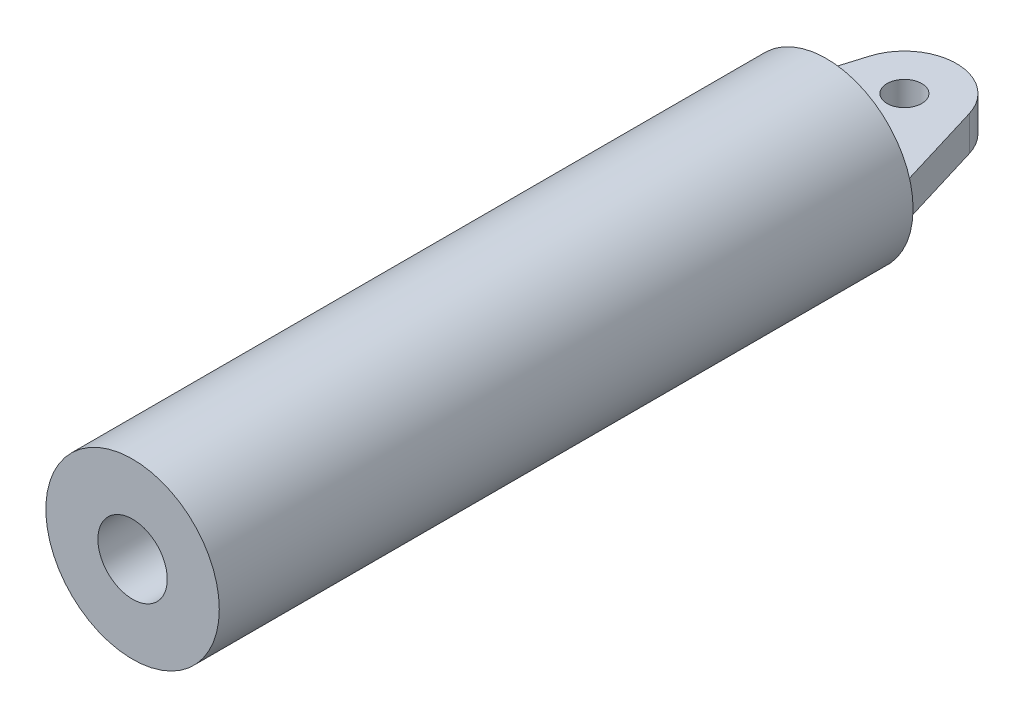
ISO-10303-21;
HEADER;
FILE_DESCRIPTION(('STEP AP214'),'2;1');
FILE_NAME('part.step','',(''),(''),'','','');
FILE_SCHEMA(('AUTOMOTIVE_DESIGN { 1 0 10303 214 1 1 1 1 }'));
ENDSEC;
DATA;
#1=APPLICATION_CONTEXT('core data for automotive mechanical design processes');
#2=APPLICATION_PROTOCOL_DEFINITION('international standard','automotive_design',2000,#1);
#3=PRODUCT_CONTEXT('',#1,'mechanical');
#4=PRODUCT('Part','Part','',(#3));
#5=PRODUCT_RELATED_PRODUCT_CATEGORY('part','',(#4));
#6=PRODUCT_DEFINITION_FORMATION('','',#4);
#7=PRODUCT_DEFINITION_CONTEXT('part definition',#1,'design');
#8=PRODUCT_DEFINITION('design','',#6,#7);
#9=PRODUCT_DEFINITION_SHAPE('','',#8);
#10=(LENGTH_UNIT() NAMED_UNIT(*) SI_UNIT(.MILLI.,.METRE.));
#11=(NAMED_UNIT(*) PLANE_ANGLE_UNIT() SI_UNIT($,.RADIAN.));
#12=(NAMED_UNIT(*) SI_UNIT($,.STERADIAN.) SOLID_ANGLE_UNIT());
#13=UNCERTAINTY_MEASURE_WITH_UNIT(LENGTH_MEASURE(1.E-05),#10,'distance_accuracy_value','');
#14=(GEOMETRIC_REPRESENTATION_CONTEXT(3) GLOBAL_UNCERTAINTY_ASSIGNED_CONTEXT((#13)) GLOBAL_UNIT_ASSIGNED_CONTEXT((#10,
#11,#12)) REPRESENTATION_CONTEXT('',''));
#15=CARTESIAN_POINT('',(0.,0.,0.));
#16=DIRECTION('',(0.,0.,1.));
#17=DIRECTION('',(1.,0.,0.));
#18=AXIS2_PLACEMENT_3D('',#15,#16,#17);
#19=CARTESIAN_POINT('',(0.,0.,0.));
#20=DIRECTION('',(0.,0.,1.));
#21=DIRECTION('',(1.,0.,0.));
#22=AXIS2_PLACEMENT_3D('',#19,#20,#21);
#23=PLANE('',#22);
#24=CARTESIAN_POINT('',(0.,0.,0.));
#25=DIRECTION('',(0.,0.,1.));
#26=DIRECTION('',(1.,0.,0.));
#27=AXIS2_PLACEMENT_3D('',#24,#25,#26);
#28=CIRCLE('',#27,50.);
#29=CARTESIAN_POINT('',(50.,0.,0.));
#30=VERTEX_POINT('',#29);
#31=EDGE_CURVE('E38',#30,#30,#28,.T.);
#32=ORIENTED_EDGE('',*,*,#31,.F.);
#33=EDGE_LOOP('',(#32));
#34=FACE_BOUND('',#33,.T.);
#35=DIRECTION('',(0.,-1.,0.));
#36=VECTOR('',#35,1.);
#37=CARTESIAN_POINT('',(45.,10.,0.));
#38=LINE('',#37,#36);
#39=CARTESIAN_POINT('',(45.,10.,0.));
#40=VERTEX_POINT('',#39);
#41=CARTESIAN_POINT('',(45.,-10.,0.));
#42=VERTEX_POINT('',#41);
#43=EDGE_CURVE('E49',#40,#42,#38,.T.);
#44=ORIENTED_EDGE('',*,*,#43,.F.);
#45=DIRECTION('',(1.,0.,0.));
#46=VECTOR('',#45,1.);
#47=CARTESIAN_POINT('',(-45.,10.,0.));
#48=LINE('',#47,#46);
#49=CARTESIAN_POINT('',(-45.,10.,0.));
#50=VERTEX_POINT('',#49);
#51=EDGE_CURVE('E81',#50,#40,#48,.T.);
#52=ORIENTED_EDGE('',*,*,#51,.F.);
#53=DIRECTION('',(0.,-1.,0.));
#54=VECTOR('',#53,1.);
#55=CARTESIAN_POINT('',(-45.,10.,0.));
#56=LINE('',#55,#54);
#57=CARTESIAN_POINT('',(-45.,-10.,0.));
#58=VERTEX_POINT('',#57);
#59=EDGE_CURVE('E97',#50,#58,#56,.T.);
#60=ORIENTED_EDGE('',*,*,#59,.T.);
#61=DIRECTION('',(1.,0.,0.));
#62=VECTOR('',#61,1.);
#63=CARTESIAN_POINT('',(-45.,-10.,0.));
#64=LINE('',#63,#62);
#65=EDGE_CURVE('E54',#58,#42,#64,.T.);
#66=ORIENTED_EDGE('',*,*,#65,.T.);
#67=EDGE_LOOP('',(#44,#52,#60,#66));
#68=FACE_BOUND('',#67,.T.);
#69=ADVANCED_FACE('F34',(#34,#68),#23,.F.);
#70=CARTESIAN_POINT('',(0.,0.,400.));
#71=DIRECTION('',(0.,0.,-1.));
#72=DIRECTION('',(-1.,0.,0.));
#73=AXIS2_PLACEMENT_3D('',#70,#71,#72);
#74=CYLINDRICAL_SURFACE('',#73,50.);
#75=CARTESIAN_POINT('',(0.,0.,400.));
#76=DIRECTION('',(0.,0.,1.));
#77=DIRECTION('',(1.,0.,0.));
#78=AXIS2_PLACEMENT_3D('',#75,#76,#77);
#79=CIRCLE('',#78,50.);
#80=CARTESIAN_POINT('',(50.,0.,400.));
#81=VERTEX_POINT('',#80);
#82=EDGE_CURVE('E11',#81,#81,#79,.T.);
#83=ORIENTED_EDGE('',*,*,#82,.F.);
#84=EDGE_LOOP('',(#83));
#85=FACE_BOUND('',#84,.T.);
#86=ORIENTED_EDGE('',*,*,#31,.T.);
#87=EDGE_LOOP('',(#86));
#88=FACE_BOUND('',#87,.T.);
#89=ADVANCED_FACE('F36',(#85,#88),#74,.T.);
#90=CARTESIAN_POINT('',(0.,0.,400.));
#91=DIRECTION('',(0.,0.,1.));
#92=DIRECTION('',(1.,0.,0.));
#93=AXIS2_PLACEMENT_3D('',#90,#91,#92);
#94=PLANE('',#93);
#95=CARTESIAN_POINT('',(0.,0.,400.));
#96=DIRECTION('',(0.,0.,1.));
#97=DIRECTION('',(1.,0.,0.));
#98=AXIS2_PLACEMENT_3D('',#95,#96,#97);
#99=CIRCLE('',#98,20.);
#100=CARTESIAN_POINT('',(20.,0.,400.));
#101=VERTEX_POINT('',#100);
#102=EDGE_CURVE('E156',#101,#101,#99,.T.);
#103=ORIENTED_EDGE('',*,*,#102,.F.);
#104=EDGE_LOOP('',(#103));
#105=FACE_BOUND('',#104,.T.);
#106=ORIENTED_EDGE('',*,*,#82,.T.);
#107=EDGE_LOOP('',(#106));
#108=FACE_BOUND('',#107,.T.);
#109=ADVANCED_FACE('F119',(#105,#108),#94,.T.);
#110=CARTESIAN_POINT('',(0.,10.,-45.));
#111=DIRECTION('',(0.,-1.,0.));
#112=DIRECTION('',(0.,0.,-1.));
#113=AXIS2_PLACEMENT_3D('',#110,#111,#112);
#114=PLANE('',#113);
#115=ORIENTED_EDGE('',*,*,#51,.T.);
#116=DIRECTION('',(-0.29027623112899,0.,-0.956942897795657));
#117=VECTOR('',#116,1.);
#118=CARTESIAN_POINT('',(28.7082869338697,10.,-53.7082869338697));
#119=LINE('',#118,#117);
#120=CARTESIAN_POINT('',(28.7082869338697,10.,-53.7082869338697));
#121=VERTEX_POINT('',#120);
#122=EDGE_CURVE('E73',#40,#121,#119,.T.);
#123=ORIENTED_EDGE('',*,*,#122,.T.);
#124=CARTESIAN_POINT('',(0.,10.,-45.));
#125=DIRECTION('',(0.,1.,0.));
#126=DIRECTION('',(0.,0.,-1.));
#127=AXIS2_PLACEMENT_3D('',#124,#125,#126);
#128=CIRCLE('',#127,30.);
#129=CARTESIAN_POINT('',(-28.7082869338697,10.,-53.7082869338697));
#130=VERTEX_POINT('',#129);
#131=EDGE_CURVE('E79',#121,#130,#128,.T.);
#132=ORIENTED_EDGE('',*,*,#131,.T.);
#133=DIRECTION('',(-0.29027623112899,0.,0.956942897795657));
#134=VECTOR('',#133,1.);
#135=CARTESIAN_POINT('',(-45.,10.,0.));
#136=LINE('',#135,#134);
#137=EDGE_CURVE('E95',#130,#50,#136,.T.);
#138=ORIENTED_EDGE('',*,*,#137,.T.);
#139=EDGE_LOOP('',(#115,#123,#132,#138));
#140=FACE_BOUND('',#139,.T.);
#141=CARTESIAN_POINT('',(0.,10.,-45.));
#142=DIRECTION('',(0.,1.,0.));
#143=DIRECTION('',(0.,0.,1.));
#144=AXIS2_PLACEMENT_3D('',#141,#142,#143);
#145=CIRCLE('',#144,9.99999999999999);
#146=CARTESIAN_POINT('',(0.,10.,-35.));
#147=VERTEX_POINT('',#146);
#148=EDGE_CURVE('E102',#147,#147,#145,.T.);
#149=ORIENTED_EDGE('',*,*,#148,.F.);
#150=EDGE_LOOP('',(#149));
#151=FACE_BOUND('',#150,.T.);
#152=ADVANCED_FACE('F75',(#140,#151),#114,.F.);
#153=CARTESIAN_POINT('',(0.,-10.,-45.));
#154=DIRECTION('',(0.,-1.,0.));
#155=DIRECTION('',(0.,0.,-1.));
#156=AXIS2_PLACEMENT_3D('',#153,#154,#155);
#157=PLANE('',#156);
#158=ORIENTED_EDGE('',*,*,#65,.F.);
#159=DIRECTION('',(-0.29027623112899,0.,0.956942897795657));
#160=VECTOR('',#159,1.);
#161=CARTESIAN_POINT('',(-45.,-10.,0.));
#162=LINE('',#161,#160);
#163=CARTESIAN_POINT('',(-28.7082869338697,-10.,-53.7082869338697));
#164=VERTEX_POINT('',#163);
#165=EDGE_CURVE('E106',#164,#58,#162,.T.);
#166=ORIENTED_EDGE('',*,*,#165,.F.);
#167=CARTESIAN_POINT('',(0.,-10.,-45.));
#168=DIRECTION('',(0.,1.,0.));
#169=DIRECTION('',(0.,0.,-1.));
#170=AXIS2_PLACEMENT_3D('',#167,#168,#169);
#171=CIRCLE('',#170,30.);
#172=CARTESIAN_POINT('',(28.7082869338697,-10.,-53.7082869338697));
#173=VERTEX_POINT('',#172);
#174=EDGE_CURVE('E104',#173,#164,#171,.T.);
#175=ORIENTED_EDGE('',*,*,#174,.F.);
#176=DIRECTION('',(-0.29027623112899,0.,-0.956942897795657));
#177=VECTOR('',#176,1.);
#178=CARTESIAN_POINT('',(28.7082869338697,-10.,-53.7082869338697));
#179=LINE('',#178,#177);
#180=EDGE_CURVE('E87',#42,#173,#179,.T.);
#181=ORIENTED_EDGE('',*,*,#180,.F.);
#182=EDGE_LOOP('',(#158,#166,#175,#181));
#183=FACE_BOUND('',#182,.T.);
#184=CARTESIAN_POINT('',(0.,-10.,-45.));
#185=DIRECTION('',(0.,1.,0.));
#186=DIRECTION('',(0.,0.,1.));
#187=AXIS2_PLACEMENT_3D('',#184,#185,#186);
#188=CIRCLE('',#187,9.99999999999999);
#189=CARTESIAN_POINT('',(0.,-10.,-35.));
#190=VERTEX_POINT('',#189);
#191=EDGE_CURVE('E159',#190,#190,#188,.T.);
#192=ORIENTED_EDGE('',*,*,#191,.T.);
#193=EDGE_LOOP('',(#192));
#194=FACE_BOUND('',#193,.T.);
#195=ADVANCED_FACE('F127',(#183,#194),#157,.T.);
#196=CARTESIAN_POINT('',(28.7082869338697,10.,-53.7082869338697));
#197=DIRECTION('',(-0.956942897795657,0.,0.29027623112899));
#198=DIRECTION('',(0.29027623112899,0.,0.956942897795657));
#199=AXIS2_PLACEMENT_3D('',#196,#197,#198);
#200=PLANE('',#199);
#201=ORIENTED_EDGE('',*,*,#180,.T.);
#202=DIRECTION('',(0.,-1.,0.));
#203=VECTOR('',#202,1.);
#204=CARTESIAN_POINT('',(28.7082869338697,10.,-53.7082869338697));
#205=LINE('',#204,#203);
#206=EDGE_CURVE('E85',#121,#173,#205,.T.);
#207=ORIENTED_EDGE('',*,*,#206,.F.);
#208=ORIENTED_EDGE('',*,*,#122,.F.);
#209=ORIENTED_EDGE('',*,*,#43,.T.);
#210=EDGE_LOOP('',(#201,#207,#208,#209));
#211=FACE_BOUND('',#210,.T.);
#212=ADVANCED_FACE('F86',(#211),#200,.F.);
#213=CARTESIAN_POINT('',(0.,10.,-45.));
#214=DIRECTION('',(0.,-1.,0.));
#215=DIRECTION('',(0.,0.,-1.));
#216=AXIS2_PLACEMENT_3D('',#213,#214,#215);
#217=CYLINDRICAL_SURFACE('',#216,30.);
#218=ORIENTED_EDGE('',*,*,#174,.T.);
#219=DIRECTION('',(0.,-1.,0.));
#220=VECTOR('',#219,1.);
#221=CARTESIAN_POINT('',(-28.7082869338697,10.,-53.7082869338697));
#222=LINE('',#221,#220);
#223=EDGE_CURVE('E90',#130,#164,#222,.T.);
#224=ORIENTED_EDGE('',*,*,#223,.F.);
#225=ORIENTED_EDGE('',*,*,#131,.F.);
#226=ORIENTED_EDGE('',*,*,#206,.T.);
#227=EDGE_LOOP('',(#218,#224,#225,#226));
#228=FACE_BOUND('',#227,.T.);
#229=ADVANCED_FACE('F92',(#228),#217,.T.);
#230=CARTESIAN_POINT('',(-45.,10.,0.));
#231=DIRECTION('',(0.956942897795657,0.,0.29027623112899));
#232=DIRECTION('',(0.29027623112899,0.,-0.956942897795657));
#233=AXIS2_PLACEMENT_3D('',#230,#231,#232);
#234=PLANE('',#233);
#235=ORIENTED_EDGE('',*,*,#165,.T.);
#236=ORIENTED_EDGE('',*,*,#59,.F.);
#237=ORIENTED_EDGE('',*,*,#137,.F.);
#238=ORIENTED_EDGE('',*,*,#223,.T.);
#239=EDGE_LOOP('',(#235,#236,#237,#238));
#240=FACE_BOUND('',#239,.T.);
#241=ADVANCED_FACE('F130',(#240),#234,.F.);
#242=CARTESIAN_POINT('',(0.,10.,-45.));
#243=DIRECTION('',(0.,-1.,0.));
#244=DIRECTION('',(0.,0.,-1.));
#245=AXIS2_PLACEMENT_3D('',#242,#243,#244);
#246=CYLINDRICAL_SURFACE('',#245,9.99999999999999);
#247=ORIENTED_EDGE('',*,*,#148,.T.);
#248=EDGE_LOOP('',(#247));
#249=FACE_BOUND('',#248,.T.);
#250=ORIENTED_EDGE('',*,*,#191,.F.);
#251=EDGE_LOOP('',(#250));
#252=FACE_BOUND('',#251,.T.);
#253=ADVANCED_FACE('F133',(#249,#252),#246,.F.);
#254=CARTESIAN_POINT('',(0.,0.,30.));
#255=DIRECTION('',(0.,0.,1.));
#256=DIRECTION('',(1.,0.,0.));
#257=AXIS2_PLACEMENT_3D('',#254,#255,#256);
#258=PLANE('',#257);
#259=CARTESIAN_POINT('',(0.,0.,30.));
#260=DIRECTION('',(0.,0.,1.));
#261=DIRECTION('',(1.,0.,0.));
#262=AXIS2_PLACEMENT_3D('',#259,#260,#261);
#263=CIRCLE('',#262,20.);
#264=CARTESIAN_POINT('',(20.,0.,30.));
#265=VERTEX_POINT('',#264);
#266=EDGE_CURVE('E154',#265,#265,#263,.T.);
#267=ORIENTED_EDGE('',*,*,#266,.T.);
#268=EDGE_LOOP('',(#267));
#269=FACE_BOUND('',#268,.T.);
#270=ADVANCED_FACE('F142',(#269),#258,.T.);
#271=CARTESIAN_POINT('',(0.,0.,400.));
#272=DIRECTION('',(0.,0.,-1.));
#273=DIRECTION('',(-1.,0.,0.));
#274=AXIS2_PLACEMENT_3D('',#271,#272,#273);
#275=CYLINDRICAL_SURFACE('',#274,20.);
#276=ORIENTED_EDGE('',*,*,#102,.T.);
#277=EDGE_LOOP('',(#276));
#278=FACE_BOUND('',#277,.T.);
#279=ORIENTED_EDGE('',*,*,#266,.F.);
#280=EDGE_LOOP('',(#279));
#281=FACE_BOUND('',#280,.T.);
#282=ADVANCED_FACE('F144',(#278,#281),#275,.F.);
#283=CLOSED_SHELL('',(#69,#89,#109,#152,#195,#212,#229,#241,#253,#270,#282));
#284=MANIFOLD_SOLID_BREP('B2',#283);
#285=ADVANCED_BREP_SHAPE_REPRESENTATION('',(#18,#284),#14);
#286=SHAPE_DEFINITION_REPRESENTATION(#9,#285);
ENDSEC;
END-ISO-10303-21;
